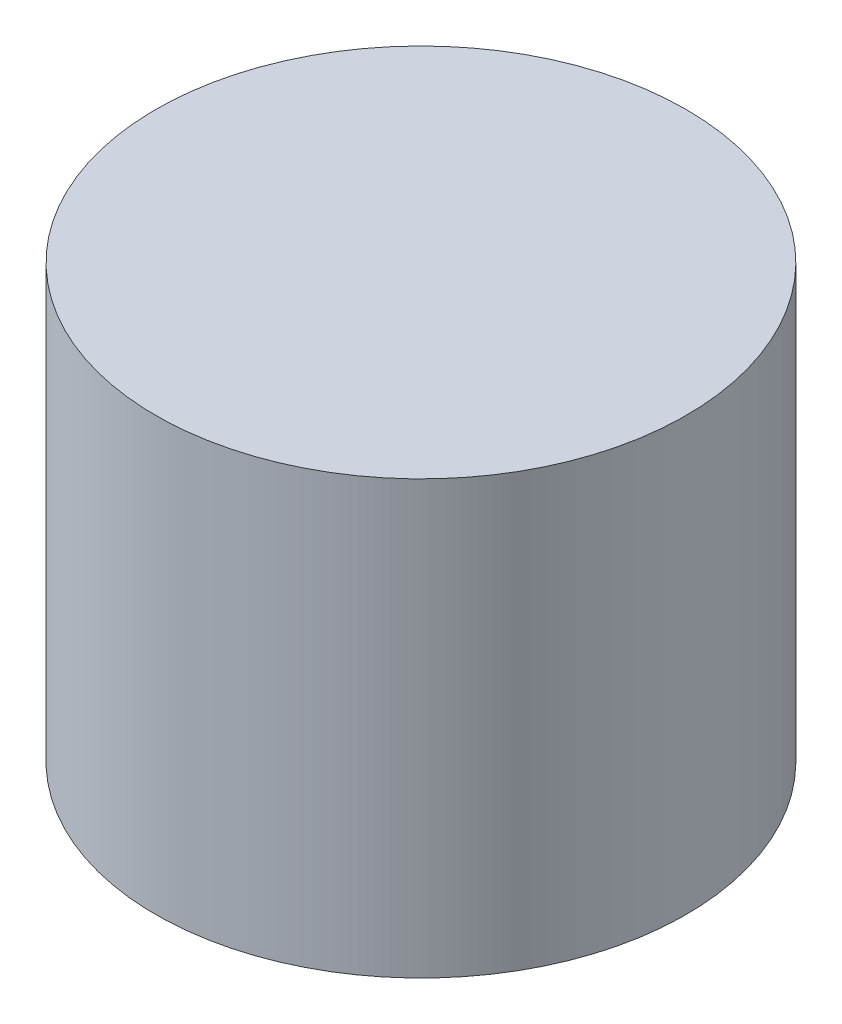
ISO-10303-21;
HEADER;
FILE_DESCRIPTION(('STEP AP214'),'2;1');
FILE_NAME('part.step','',(''),(''),'','','');
FILE_SCHEMA(('AUTOMOTIVE_DESIGN { 1 0 10303 214 1 1 1 1 }'));
ENDSEC;
DATA;
#1=APPLICATION_CONTEXT('core data for automotive mechanical design processes');
#2=APPLICATION_PROTOCOL_DEFINITION('international standard','automotive_design',2000,#1);
#3=PRODUCT_CONTEXT('',#1,'mechanical');
#4=PRODUCT('Part','Part','',(#3));
#5=PRODUCT_RELATED_PRODUCT_CATEGORY('part','',(#4));
#6=PRODUCT_DEFINITION_FORMATION('','',#4);
#7=PRODUCT_DEFINITION_CONTEXT('part definition',#1,'design');
#8=PRODUCT_DEFINITION('design','',#6,#7);
#9=PRODUCT_DEFINITION_SHAPE('','',#8);
#10=(LENGTH_UNIT() NAMED_UNIT(*) SI_UNIT(.MILLI.,.METRE.));
#11=(NAMED_UNIT(*) PLANE_ANGLE_UNIT() SI_UNIT($,.RADIAN.));
#12=(NAMED_UNIT(*) SI_UNIT($,.STERADIAN.) SOLID_ANGLE_UNIT());
#13=UNCERTAINTY_MEASURE_WITH_UNIT(LENGTH_MEASURE(1.E-05),#10,'distance_accuracy_value','');
#14=(GEOMETRIC_REPRESENTATION_CONTEXT(3) GLOBAL_UNCERTAINTY_ASSIGNED_CONTEXT((#13)) GLOBAL_UNIT_ASSIGNED_CONTEXT((#10,
#11,#12)) REPRESENTATION_CONTEXT('',''));
#15=CARTESIAN_POINT('',(0.,0.,0.));
#16=DIRECTION('',(0.,0.,1.));
#17=DIRECTION('',(1.,0.,0.));
#18=AXIS2_PLACEMENT_3D('',#15,#16,#17);
#19=CARTESIAN_POINT('',(0.,61.15,0.));
#20=DIRECTION('',(0.,-1.,0.));
#21=DIRECTION('',(0.,0.,-1.));
#22=AXIS2_PLACEMENT_3D('',#19,#20,#21);
#23=CYLINDRICAL_SURFACE('',#22,37.5);
#24=CARTESIAN_POINT('',(0.,61.15,0.));
#25=DIRECTION('',(0.,1.,0.));
#26=DIRECTION('',(0.,0.,1.));
#27=AXIS2_PLACEMENT_3D('',#24,#25,#26);
#28=CIRCLE('',#27,37.5);
#29=CARTESIAN_POINT('',(0.,61.15,-37.5));
#30=VERTEX_POINT('',#29);
#31=EDGE_CURVE('E10',#30,#30,#28,.T.);
#32=CARTESIAN_POINT('',(0.,0.,0.));
#33=DIRECTION('',(0.,1.,0.));
#34=DIRECTION('',(0.,0.,1.));
#35=AXIS2_PLACEMENT_3D('',#32,#33,#34);
#36=CIRCLE('',#35,37.5);
#37=CARTESIAN_POINT('',(0.,0.,-37.5));
#38=VERTEX_POINT('',#37);
#39=EDGE_CURVE('E42',#38,#38,#36,.T.);
#40=CARTESIAN_POINT('',(0.,61.15,-37.5));
#41=CARTESIAN_POINT('',(0.,60.5130208333333,-37.5));
#42=CARTESIAN_POINT('',(0.,59.8760416666667,-37.5));
#43=CARTESIAN_POINT('',(0.,58.6020833333333,-37.5));
#44=CARTESIAN_POINT('',(0.,57.9651041666667,-37.5));
#45=CARTESIAN_POINT('',(0.,56.6911458333333,-37.5));
#46=CARTESIAN_POINT('',(0.,56.0541666666667,-37.5));
#47=CARTESIAN_POINT('',(0.,54.7802083333333,-37.5));
#48=CARTESIAN_POINT('',(0.,54.1432291666667,-37.5));
#49=CARTESIAN_POINT('',(0.,52.8692708333333,-37.5));
#50=CARTESIAN_POINT('',(0.,52.2322916666667,-37.5));
#51=CARTESIAN_POINT('',(0.,50.9583333333333,-37.5));
#52=CARTESIAN_POINT('',(0.,50.3213541666667,-37.5));
#53=CARTESIAN_POINT('',(0.,49.0473958333333,-37.5));
#54=CARTESIAN_POINT('',(0.,48.4104166666667,-37.5));
#55=CARTESIAN_POINT('',(0.,47.1364583333333,-37.5));
#56=CARTESIAN_POINT('',(0.,46.4994791666667,-37.5));
#57=CARTESIAN_POINT('',(0.,45.2255208333333,-37.5));
#58=CARTESIAN_POINT('',(0.,44.5885416666667,-37.5));
#59=CARTESIAN_POINT('',(0.,43.3145833333333,-37.5));
#60=CARTESIAN_POINT('',(0.,42.6776041666667,-37.5));
#61=CARTESIAN_POINT('',(0.,41.4036458333333,-37.5));
#62=CARTESIAN_POINT('',(0.,40.7666666666667,-37.5));
#63=CARTESIAN_POINT('',(0.,39.4927083333333,-37.5));
#64=CARTESIAN_POINT('',(0.,38.8557291666667,-37.5));
#65=CARTESIAN_POINT('',(0.,37.5817708333333,-37.5));
#66=CARTESIAN_POINT('',(0.,36.9447916666667,-37.5));
#67=CARTESIAN_POINT('',(0.,35.6708333333333,-37.5));
#68=CARTESIAN_POINT('',(0.,35.0338541666667,-37.5));
#69=CARTESIAN_POINT('',(0.,33.7598958333333,-37.5));
#70=CARTESIAN_POINT('',(0.,33.1229166666667,-37.5));
#71=CARTESIAN_POINT('',(0.,31.8489583333333,-37.5));
#72=CARTESIAN_POINT('',(0.,31.2119791666667,-37.5));
#73=CARTESIAN_POINT('',(0.,29.9380208333333,-37.5));
#74=CARTESIAN_POINT('',(0.,29.3010416666667,-37.5));
#75=CARTESIAN_POINT('',(0.,28.0270833333333,-37.5));
#76=CARTESIAN_POINT('',(0.,27.3901041666667,-37.5));
#77=CARTESIAN_POINT('',(0.,26.1161458333333,-37.5));
#78=CARTESIAN_POINT('',(0.,25.4791666666667,-37.5));
#79=CARTESIAN_POINT('',(0.,24.2052083333333,-37.5));
#80=CARTESIAN_POINT('',(0.,23.5682291666667,-37.5));
#81=CARTESIAN_POINT('',(0.,22.2942708333333,-37.5));
#82=CARTESIAN_POINT('',(0.,21.6572916666667,-37.5));
#83=CARTESIAN_POINT('',(0.,20.3833333333333,-37.5));
#84=CARTESIAN_POINT('',(0.,19.7463541666667,-37.5));
#85=CARTESIAN_POINT('',(0.,18.4723958333333,-37.5));
#86=CARTESIAN_POINT('',(0.,17.8354166666667,-37.5));
#87=CARTESIAN_POINT('',(0.,16.5614583333333,-37.5));
#88=CARTESIAN_POINT('',(0.,15.9244791666667,-37.5));
#89=CARTESIAN_POINT('',(0.,14.6505208333333,-37.5));
#90=CARTESIAN_POINT('',(0.,14.0135416666667,-37.5));
#91=CARTESIAN_POINT('',(0.,12.7395833333333,-37.5));
#92=CARTESIAN_POINT('',(0.,12.1026041666667,-37.5));
#93=CARTESIAN_POINT('',(0.,10.8286458333333,-37.5));
#94=CARTESIAN_POINT('',(0.,10.1916666666667,-37.5));
#95=CARTESIAN_POINT('',(0.,8.91770833333333,-37.5));
#96=CARTESIAN_POINT('',(0.,8.28072916666666,-37.5));
#97=CARTESIAN_POINT('',(0.,7.00677083333333,-37.5));
#98=CARTESIAN_POINT('',(0.,6.36979166666666,-37.5));
#99=CARTESIAN_POINT('',(0.,5.09583333333333,-37.5));
#100=CARTESIAN_POINT('',(0.,4.45885416666666,-37.5));
#101=CARTESIAN_POINT('',(0.,3.18489583333333,-37.5));
#102=CARTESIAN_POINT('',(0.,2.54791666666666,-37.5));
#103=CARTESIAN_POINT('',(0.,1.27395833333333,-37.5));
#104=CARTESIAN_POINT('',(0.,0.63697916666666,-37.5));
#105=CARTESIAN_POINT('',(0.,0.,-37.5));
#106=B_SPLINE_CURVE_WITH_KNOTS('',3,(#40,#41,#42,#43,#44,#45,#46,#47,#48,#49,#50,#51,#52,#53,
#54,#55,#56,#57,#58,#59,#60,#61,#62,#63,#64,#65,#66,#67,#68,#69,#70,#71,#72,#73,#74,#75,#76,#77,
#78,#79,#80,#81,#82,#83,#84,#85,#86,#87,#88,#89,#90,#91,#92,#93,#94,#95,#96,#97,#98,#99,#100,
#101,#102,#103,#104,#105),.UNSPECIFIED.,.F.,.F.,(4,2,2,2,2,2,2,2,2,2,2,2,2,2,2,2,2,2,2,2,2,2,2,
2,2,2,2,2,2,2,2,2,4),(0.,1.9109375,3.821875,5.7328125,7.64375,9.55468750000001,11.465625,
13.3765625,15.2875,17.1984375,19.109375,21.0203125,22.93125,24.8421875,26.753125,28.6640625,
30.575,32.4859375,34.396875,36.3078125,38.21875,40.1296875,42.040625,43.9515625,45.8625,
47.7734375,49.684375,51.5953125,53.50625,55.4171875,57.328125,59.2390625,61.15),.UNSPECIFIED.);
#107=EDGE_CURVE('BSEAM39',#30,#38,#106,.T.);
#108=ORIENTED_EDGE('',*,*,#31,.F.);
#109=ORIENTED_EDGE('',*,*,#39,.T.);
#110=ORIENTED_EDGE('',*,*,#107,.T.);
#111=ORIENTED_EDGE('',*,*,#107,.F.);
#112=EDGE_LOOP('',(#108,#110,#109,#111));
#113=FACE_BOUND('',#112,.T.);
#114=ADVANCED_FACE('F39',(#113),#23,.T.);
#115=CARTESIAN_POINT('',(0.,61.15,0.));
#116=DIRECTION('',(0.,1.,0.));
#117=DIRECTION('',(0.,0.,1.));
#118=AXIS2_PLACEMENT_3D('',#115,#116,#117);
#119=PLANE('',#118);
#120=ORIENTED_EDGE('',*,*,#31,.T.);
#121=EDGE_LOOP('',(#120));
#122=FACE_BOUND('',#121,.T.);
#123=ADVANCED_FACE('F56',(#122),#119,.T.);
#124=CARTESIAN_POINT('',(0.,0.,0.));
#125=DIRECTION('',(0.,1.,0.));
#126=DIRECTION('',(0.,0.,1.));
#127=AXIS2_PLACEMENT_3D('',#124,#125,#126);
#128=PLANE('',#127);
#129=ORIENTED_EDGE('',*,*,#39,.F.);
#130=EDGE_LOOP('',(#129));
#131=FACE_BOUND('',#130,.T.);
#132=ADVANCED_FACE('F54',(#131),#128,.F.);
#133=CLOSED_SHELL('',(#114,#123,#132));
#134=MANIFOLD_SOLID_BREP('B2',#133);
#135=ADVANCED_BREP_SHAPE_REPRESENTATION('',(#18,#134),#14);
#136=SHAPE_DEFINITION_REPRESENTATION(#9,#135);
ENDSEC;
END-ISO-10303-21;
